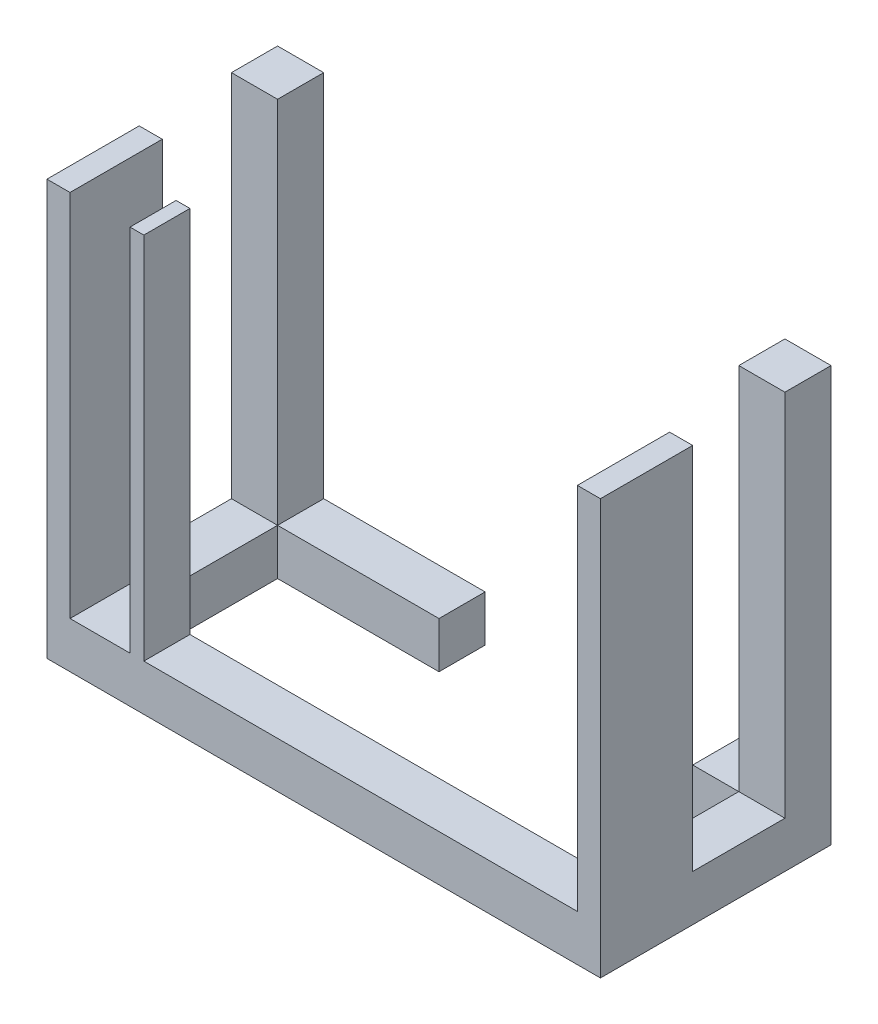
ISO-10303-21;
HEADER;
FILE_DESCRIPTION(('STEP AP214'),'2;1');
FILE_NAME('part.step','',(''),(''),'','','');
FILE_SCHEMA(('AUTOMOTIVE_DESIGN { 1 0 10303 214 1 1 1 1 }'));
ENDSEC;
DATA;
#1=APPLICATION_CONTEXT('core data for automotive mechanical design processes');
#2=APPLICATION_PROTOCOL_DEFINITION('international standard','automotive_design',2000,#1);
#3=PRODUCT_CONTEXT('',#1,'mechanical');
#4=PRODUCT('Part','Part','',(#3));
#5=PRODUCT_RELATED_PRODUCT_CATEGORY('part','',(#4));
#6=PRODUCT_DEFINITION_FORMATION('','',#4);
#7=PRODUCT_DEFINITION_CONTEXT('part definition',#1,'design');
#8=PRODUCT_DEFINITION('design','',#6,#7);
#9=PRODUCT_DEFINITION_SHAPE('','',#8);
#10=(LENGTH_UNIT() NAMED_UNIT(*) SI_UNIT(.MILLI.,.METRE.));
#11=(NAMED_UNIT(*) PLANE_ANGLE_UNIT() SI_UNIT($,.RADIAN.));
#12=(NAMED_UNIT(*) SI_UNIT($,.STERADIAN.) SOLID_ANGLE_UNIT());
#13=UNCERTAINTY_MEASURE_WITH_UNIT(LENGTH_MEASURE(1.E-05),#10,'distance_accuracy_value','');
#14=(GEOMETRIC_REPRESENTATION_CONTEXT(3) GLOBAL_UNCERTAINTY_ASSIGNED_CONTEXT((#13)) GLOBAL_UNIT_ASSIGNED_CONTEXT((#10,
#11,#12)) REPRESENTATION_CONTEXT('',''));
#15=CARTESIAN_POINT('',(0.,0.,0.));
#16=DIRECTION('',(0.,0.,1.));
#17=DIRECTION('',(1.,0.,0.));
#18=AXIS2_PLACEMENT_3D('',#15,#16,#17);
#19=CARTESIAN_POINT('',(0.,10.,0.));
#20=DIRECTION('',(0.,-1.,0.));
#21=DIRECTION('',(0.,0.,-1.));
#22=AXIS2_PLACEMENT_3D('',#19,#20,#21);
#23=PLANE('',#22);
#24=DIRECTION('',(-1.,0.,0.));
#25=VECTOR('',#24,1.);
#26=CARTESIAN_POINT('',(-60.,10.,-25.));
#27=LINE('',#26,#25);
#28=CARTESIAN_POINT('',(50.,10.,-25.));
#29=VERTEX_POINT('',#28);
#30=CARTESIAN_POINT('',(40.,10.,-25.));
#31=VERTEX_POINT('',#30);
#32=EDGE_CURVE('E256',#29,#31,#27,.T.);
#33=ORIENTED_EDGE('',*,*,#32,.T.);
#34=DIRECTION('',(0.,0.,1.));
#35=VECTOR('',#34,1.);
#36=CARTESIAN_POINT('',(40.,10.,0.));
#37=LINE('',#36,#35);
#38=CARTESIAN_POINT('',(40.,10.,-15.));
#39=VERTEX_POINT('',#38);
#40=EDGE_CURVE('E302',#31,#39,#37,.T.);
#41=ORIENTED_EDGE('',*,*,#40,.T.);
#42=DIRECTION('',(-1.,0.,0.));
#43=VECTOR('',#42,1.);
#44=CARTESIAN_POINT('',(-50.,10.,-15.));
#45=LINE('',#44,#43);
#46=CARTESIAN_POINT('',(50.,10.,-15.));
#47=VERTEX_POINT('',#46);
#48=EDGE_CURVE('E244',#47,#39,#45,.T.);
#49=ORIENTED_EDGE('',*,*,#48,.F.);
#50=DIRECTION('',(0.,0.,1.));
#51=VECTOR('',#50,1.);
#52=CARTESIAN_POINT('',(50.,10.,-25.));
#53=LINE('',#52,#51);
#54=EDGE_CURVE('E328',#29,#47,#53,.T.);
#55=ORIENTED_EDGE('',*,*,#54,.F.);
#56=EDGE_LOOP('',(#33,#41,#49,#55));
#57=FACE_BOUND('',#56,.T.);
#58=ADVANCED_FACE('F35',(#57),#23,.F.);
#59=CARTESIAN_POINT('',(-60.,10.,-25.));
#60=DIRECTION('',(0.,0.,1.));
#61=DIRECTION('',(1.,0.,0.));
#62=AXIS2_PLACEMENT_3D('',#59,#60,#61);
#63=PLANE('',#62);
#64=DIRECTION('',(-1.,0.,0.));
#65=VECTOR('',#64,1.);
#66=CARTESIAN_POINT('',(-60.,0.,-25.));
#67=LINE('',#66,#65);
#68=CARTESIAN_POINT('',(60.,0.,-25.));
#69=VERTEX_POINT('',#68);
#70=CARTESIAN_POINT('',(40.,0.,-25.));
#71=VERTEX_POINT('',#70);
#72=EDGE_CURVE('E268',#69,#71,#67,.T.);
#73=ORIENTED_EDGE('',*,*,#72,.T.);
#74=DIRECTION('',(0.,-1.,0.));
#75=VECTOR('',#74,1.);
#76=CARTESIAN_POINT('',(40.,90.,-25.));
#77=LINE('',#76,#75);
#78=EDGE_CURVE('E298',#31,#71,#77,.T.);
#79=ORIENTED_EDGE('',*,*,#78,.F.);
#80=ORIENTED_EDGE('',*,*,#32,.F.);
#81=DIRECTION('',(0.,-1.,0.));
#82=VECTOR('',#81,1.);
#83=CARTESIAN_POINT('',(50.,90.,-25.));
#84=LINE('',#83,#82);
#85=CARTESIAN_POINT('',(50.,90.,-25.));
#86=VERTEX_POINT('',#85);
#87=EDGE_CURVE('E347',#86,#29,#84,.T.);
#88=ORIENTED_EDGE('',*,*,#87,.F.);
#89=DIRECTION('',(-1.,0.,0.));
#90=VECTOR('',#89,1.);
#91=CARTESIAN_POINT('',(60.,90.,-25.));
#92=LINE('',#91,#90);
#93=CARTESIAN_POINT('',(60.,90.,-25.));
#94=VERTEX_POINT('',#93);
#95=EDGE_CURVE('E288',#94,#86,#92,.T.);
#96=ORIENTED_EDGE('',*,*,#95,.F.);
#97=DIRECTION('',(0.,-1.,0.));
#98=VECTOR('',#97,1.);
#99=CARTESIAN_POINT('',(60.,10.,-25.));
#100=LINE('',#99,#98);
#101=EDGE_CURVE('E217',#94,#69,#100,.T.);
#102=ORIENTED_EDGE('',*,*,#101,.T.);
#103=EDGE_LOOP('',(#73,#79,#80,#88,#96,#102));
#104=FACE_BOUND('',#103,.T.);
#105=ADVANCED_FACE('F285',(#104),#63,.F.);
#106=CARTESIAN_POINT('',(-50.,10.,-15.));
#107=DIRECTION('',(0.,0.,1.));
#108=DIRECTION('',(1.,0.,0.));
#109=AXIS2_PLACEMENT_3D('',#106,#107,#108);
#110=PLANE('',#109);
#111=DIRECTION('',(0.,1.,0.));
#112=VECTOR('',#111,1.);
#113=CARTESIAN_POINT('',(40.,10.,-15.));
#114=LINE('',#113,#112);
#115=CARTESIAN_POINT('',(40.,0.,-15.));
#116=VERTEX_POINT('',#115);
#117=EDGE_CURVE('E11',#116,#39,#114,.T.);
#118=ORIENTED_EDGE('',*,*,#117,.F.);
#119=DIRECTION('',(-1.,0.,0.));
#120=VECTOR('',#119,1.);
#121=CARTESIAN_POINT('',(-50.,0.,-15.));
#122=LINE('',#121,#120);
#123=CARTESIAN_POINT('',(50.,0.,-15.));
#124=VERTEX_POINT('',#123);
#125=EDGE_CURVE('E232',#124,#116,#122,.T.);
#126=ORIENTED_EDGE('',*,*,#125,.F.);
#127=DIRECTION('',(0.,-1.,0.));
#128=VECTOR('',#127,1.);
#129=CARTESIAN_POINT('',(50.,10.,-15.));
#130=LINE('',#129,#128);
#131=EDGE_CURVE('E243',#47,#124,#130,.T.);
#132=ORIENTED_EDGE('',*,*,#131,.F.);
#133=ORIENTED_EDGE('',*,*,#48,.T.);
#134=EDGE_LOOP('',(#118,#126,#132,#133));
#135=FACE_BOUND('',#134,.T.);
#136=ADVANCED_FACE('F521',(#135),#110,.T.);
#137=DIRECTION('',(0.,0.,-1.));
#138=VECTOR('',#137,1.);
#139=CARTESIAN_POINT('',(-39.,10.,25.));
#140=LINE('',#139,#138);
#141=CARTESIAN_POINT('',(-39.,10.,25.));
#142=VERTEX_POINT('',#141);
#143=CARTESIAN_POINT('',(-39.,10.,15.));
#144=VERTEX_POINT('',#143);
#145=EDGE_CURVE('E305',#142,#144,#140,.T.);
#146=ORIENTED_EDGE('',*,*,#145,.F.);
#147=DIRECTION('',(1.,0.,0.));
#148=VECTOR('',#147,1.);
#149=CARTESIAN_POINT('',(-60.,10.,25.));
#150=LINE('',#149,#148);
#151=CARTESIAN_POINT('',(55.,10.,25.));
#152=VERTEX_POINT('',#151);
#153=EDGE_CURVE('E261',#142,#152,#150,.T.);
#154=ORIENTED_EDGE('',*,*,#153,.T.);
#155=DIRECTION('',(0.,0.,1.));
#156=VECTOR('',#155,1.);
#157=CARTESIAN_POINT('',(55.,10.,25.));
#158=LINE('',#157,#156);
#159=CARTESIAN_POINT('',(55.,10.,4.99999999999999));
#160=VERTEX_POINT('',#159);
#161=EDGE_CURVE('E404',#160,#152,#158,.T.);
#162=ORIENTED_EDGE('',*,*,#161,.F.);
#163=DIRECTION('',(-1.,0.,0.));
#164=VECTOR('',#163,1.);
#165=CARTESIAN_POINT('',(60.,10.,4.99999999999999));
#166=LINE('',#165,#164);
#167=CARTESIAN_POINT('',(60.,10.,4.99999999999999));
#168=VERTEX_POINT('',#167);
#169=EDGE_CURVE('E399',#168,#160,#166,.T.);
#170=ORIENTED_EDGE('',*,*,#169,.F.);
#171=DIRECTION('',(0.,0.,-1.));
#172=VECTOR('',#171,1.);
#173=CARTESIAN_POINT('',(60.,10.,25.));
#174=LINE('',#173,#172);
#175=CARTESIAN_POINT('',(60.,10.,-15.));
#176=VERTEX_POINT('',#175);
#177=EDGE_CURVE('E252',#168,#176,#174,.T.);
#178=ORIENTED_EDGE('',*,*,#177,.T.);
#179=DIRECTION('',(1.,0.,0.));
#180=VECTOR('',#179,1.);
#181=CARTESIAN_POINT('',(60.,10.,-15.));
#182=LINE('',#181,#180);
#183=EDGE_CURVE('E331',#47,#176,#182,.T.);
#184=ORIENTED_EDGE('',*,*,#183,.F.);
#185=DIRECTION('',(0.,0.,-1.));
#186=VECTOR('',#185,1.);
#187=CARTESIAN_POINT('',(50.,10.,15.));
#188=LINE('',#187,#186);
#189=CARTESIAN_POINT('',(50.,10.,15.));
#190=VERTEX_POINT('',#189);
#191=EDGE_CURVE('E430',#190,#47,#188,.T.);
#192=ORIENTED_EDGE('',*,*,#191,.F.);
#193=DIRECTION('',(1.,0.,0.));
#194=VECTOR('',#193,1.);
#195=CARTESIAN_POINT('',(-50.,10.,15.));
#196=LINE('',#195,#194);
#197=EDGE_CURVE('E426',#144,#190,#196,.T.);
#198=ORIENTED_EDGE('',*,*,#197,.F.);
#199=EDGE_LOOP('',(#146,#154,#162,#170,#178,#184,#192,#198));
#200=FACE_BOUND('',#199,.T.);
#201=ADVANCED_FACE('F496',(#200),#23,.F.);
#202=DIRECTION('',(0.,0.,1.));
#203=VECTOR('',#202,1.);
#204=CARTESIAN_POINT('',(-42.,10.,25.));
#205=LINE('',#204,#203);
#206=CARTESIAN_POINT('',(-42.,10.,15.));
#207=VERTEX_POINT('',#206);
#208=CARTESIAN_POINT('',(-42.,10.,25.));
#209=VERTEX_POINT('',#208);
#210=EDGE_CURVE('E310',#207,#209,#205,.T.);
#211=ORIENTED_EDGE('',*,*,#210,.F.);
#212=CARTESIAN_POINT('',(-50.,10.,15.));
#213=VERTEX_POINT('',#212);
#214=EDGE_CURVE('E427',#213,#207,#196,.T.);
#215=ORIENTED_EDGE('',*,*,#214,.F.);
#216=DIRECTION('',(0.,0.,1.));
#217=VECTOR('',#216,1.);
#218=CARTESIAN_POINT('',(-50.,10.,15.));
#219=LINE('',#218,#217);
#220=CARTESIAN_POINT('',(-50.,10.,-15.));
#221=VERTEX_POINT('',#220);
#222=EDGE_CURVE('E236',#221,#213,#219,.T.);
#223=ORIENTED_EDGE('',*,*,#222,.F.);
#224=DIRECTION('',(1.,0.,0.));
#225=VECTOR('',#224,1.);
#226=CARTESIAN_POINT('',(-60.,10.,-15.));
#227=LINE('',#226,#225);
#228=CARTESIAN_POINT('',(-60.,10.,-15.));
#229=VERTEX_POINT('',#228);
#230=EDGE_CURVE('E350',#229,#221,#227,.T.);
#231=ORIENTED_EDGE('',*,*,#230,.F.);
#232=DIRECTION('',(0.,0.,1.));
#233=VECTOR('',#232,1.);
#234=CARTESIAN_POINT('',(-60.,10.,25.));
#235=LINE('',#234,#233);
#236=CARTESIAN_POINT('',(-60.,10.,4.99999999999999));
#237=VERTEX_POINT('',#236);
#238=EDGE_CURVE('E259',#229,#237,#235,.T.);
#239=ORIENTED_EDGE('',*,*,#238,.T.);
#240=DIRECTION('',(-1.,0.,0.));
#241=VECTOR('',#240,1.);
#242=CARTESIAN_POINT('',(-60.,10.,4.99999999999999));
#243=LINE('',#242,#241);
#244=CARTESIAN_POINT('',(-55.,10.,4.99999999999999));
#245=VERTEX_POINT('',#244);
#246=EDGE_CURVE('E380',#245,#237,#243,.T.);
#247=ORIENTED_EDGE('',*,*,#246,.F.);
#248=DIRECTION('',(0.,0.,-1.));
#249=VECTOR('',#248,1.);
#250=CARTESIAN_POINT('',(-55.,10.,25.));
#251=LINE('',#250,#249);
#252=CARTESIAN_POINT('',(-55.,10.,25.));
#253=VERTEX_POINT('',#252);
#254=EDGE_CURVE('E375',#253,#245,#251,.T.);
#255=ORIENTED_EDGE('',*,*,#254,.F.);
#256=EDGE_CURVE('E262',#253,#209,#150,.T.);
#257=ORIENTED_EDGE('',*,*,#256,.T.);
#258=EDGE_LOOP('',(#211,#215,#223,#231,#239,#247,#255,#257));
#259=FACE_BOUND('',#258,.T.);
#260=ADVANCED_FACE('F449',(#259),#23,.F.);
#261=CARTESIAN_POINT('',(-15.,10.,-15.));
#262=VERTEX_POINT('',#261);
#263=EDGE_CURVE('E433',#262,#221,#45,.T.);
#264=ORIENTED_EDGE('',*,*,#263,.F.);
#265=DIRECTION('',(0.,0.,-1.));
#266=VECTOR('',#265,1.);
#267=CARTESIAN_POINT('',(-15.,10.,0.));
#268=LINE('',#267,#266);
#269=CARTESIAN_POINT('',(-15.,10.,-25.));
#270=VERTEX_POINT('',#269);
#271=EDGE_CURVE('E50',#262,#270,#268,.T.);
#272=ORIENTED_EDGE('',*,*,#271,.T.);
#273=CARTESIAN_POINT('',(-50.,10.,-25.));
#274=VERTEX_POINT('',#273);
#275=EDGE_CURVE('E254',#270,#274,#27,.T.);
#276=ORIENTED_EDGE('',*,*,#275,.T.);
#277=DIRECTION('',(0.,0.,-1.));
#278=VECTOR('',#277,1.);
#279=CARTESIAN_POINT('',(-50.,10.,-25.));
#280=LINE('',#279,#278);
#281=EDGE_CURVE('E355',#221,#274,#280,.T.);
#282=ORIENTED_EDGE('',*,*,#281,.F.);
#283=EDGE_LOOP('',(#264,#272,#276,#282));
#284=FACE_BOUND('',#283,.T.);
#285=ADVANCED_FACE('F536',(#284),#23,.F.);
#286=CARTESIAN_POINT('',(0.,0.,0.));
#287=DIRECTION('',(0.,-1.,0.));
#288=DIRECTION('',(0.,0.,-1.));
#289=AXIS2_PLACEMENT_3D('',#286,#287,#288);
#290=PLANE('',#289);
#291=DIRECTION('',(0.,0.,1.));
#292=VECTOR('',#291,1.);
#293=CARTESIAN_POINT('',(40.,0.,-15.));
#294=LINE('',#293,#292);
#295=EDGE_CURVE('E57',#71,#116,#294,.T.);
#296=ORIENTED_EDGE('',*,*,#295,.F.);
#297=ORIENTED_EDGE('',*,*,#72,.F.);
#298=DIRECTION('',(0.,0.,-1.));
#299=VECTOR('',#298,1.);
#300=CARTESIAN_POINT('',(60.,0.,25.));
#301=LINE('',#300,#299);
#302=CARTESIAN_POINT('',(60.,0.,25.));
#303=VERTEX_POINT('',#302);
#304=EDGE_CURVE('E251',#303,#69,#301,.T.);
#305=ORIENTED_EDGE('',*,*,#304,.F.);
#306=DIRECTION('',(1.,0.,0.));
#307=VECTOR('',#306,1.);
#308=CARTESIAN_POINT('',(-60.,0.,25.));
#309=LINE('',#308,#307);
#310=CARTESIAN_POINT('',(-60.,0.,25.));
#311=VERTEX_POINT('',#310);
#312=EDGE_CURVE('E255',#311,#303,#309,.T.);
#313=ORIENTED_EDGE('',*,*,#312,.F.);
#314=DIRECTION('',(0.,0.,1.));
#315=VECTOR('',#314,1.);
#316=CARTESIAN_POINT('',(-60.,0.,25.));
#317=LINE('',#316,#315);
#318=CARTESIAN_POINT('',(-60.,0.,-25.));
#319=VERTEX_POINT('',#318);
#320=EDGE_CURVE('E271',#319,#311,#317,.T.);
#321=ORIENTED_EDGE('',*,*,#320,.F.);
#322=CARTESIAN_POINT('',(-15.,0.,-25.));
#323=VERTEX_POINT('',#322);
#324=EDGE_CURVE('E225',#323,#319,#67,.T.);
#325=ORIENTED_EDGE('',*,*,#324,.F.);
#326=DIRECTION('',(0.,0.,-1.));
#327=VECTOR('',#326,1.);
#328=CARTESIAN_POINT('',(-15.,0.,-15.));
#329=LINE('',#328,#327);
#330=CARTESIAN_POINT('',(-15.,0.,-15.));
#331=VERTEX_POINT('',#330);
#332=EDGE_CURVE('E212',#331,#323,#329,.T.);
#333=ORIENTED_EDGE('',*,*,#332,.F.);
#334=CARTESIAN_POINT('',(-50.,0.,-15.));
#335=VERTEX_POINT('',#334);
#336=EDGE_CURVE('E222',#331,#335,#122,.T.);
#337=ORIENTED_EDGE('',*,*,#336,.T.);
#338=DIRECTION('',(0.,0.,1.));
#339=VECTOR('',#338,1.);
#340=CARTESIAN_POINT('',(-50.,0.,15.));
#341=LINE('',#340,#339);
#342=CARTESIAN_POINT('',(-50.,0.,15.));
#343=VERTEX_POINT('',#342);
#344=EDGE_CURVE('E424',#335,#343,#341,.T.);
#345=ORIENTED_EDGE('',*,*,#344,.T.);
#346=DIRECTION('',(1.,0.,0.));
#347=VECTOR('',#346,1.);
#348=CARTESIAN_POINT('',(-50.,0.,15.));
#349=LINE('',#348,#347);
#350=CARTESIAN_POINT('',(50.,0.,15.));
#351=VERTEX_POINT('',#350);
#352=EDGE_CURVE('E238',#343,#351,#349,.T.);
#353=ORIENTED_EDGE('',*,*,#352,.T.);
#354=DIRECTION('',(0.,0.,-1.));
#355=VECTOR('',#354,1.);
#356=CARTESIAN_POINT('',(50.,0.,15.));
#357=LINE('',#356,#355);
#358=EDGE_CURVE('E233',#351,#124,#357,.T.);
#359=ORIENTED_EDGE('',*,*,#358,.T.);
#360=ORIENTED_EDGE('',*,*,#125,.T.);
#361=EDGE_LOOP('',(#296,#297,#305,#313,#321,#325,#333,#337,#345,#353,#359,#360));
#362=FACE_BOUND('',#361,.T.);
#363=ADVANCED_FACE('F220',(#362),#290,.T.);
#364=CARTESIAN_POINT('',(60.,10.,25.));
#365=DIRECTION('',(-1.,0.,0.));
#366=DIRECTION('',(0.,0.,1.));
#367=AXIS2_PLACEMENT_3D('',#364,#365,#366);
#368=PLANE('',#367);
#369=ORIENTED_EDGE('',*,*,#304,.T.);
#370=ORIENTED_EDGE('',*,*,#101,.F.);
#371=DIRECTION('',(0.,0.,-1.));
#372=VECTOR('',#371,1.);
#373=CARTESIAN_POINT('',(60.,90.,-25.));
#374=LINE('',#373,#372);
#375=CARTESIAN_POINT('',(60.,90.,-15.));
#376=VERTEX_POINT('',#375);
#377=EDGE_CURVE('E329',#376,#94,#374,.T.);
#378=ORIENTED_EDGE('',*,*,#377,.F.);
#379=DIRECTION('',(0.,-1.,0.));
#380=VECTOR('',#379,1.);
#381=CARTESIAN_POINT('',(60.,90.,-15.));
#382=LINE('',#381,#380);
#383=EDGE_CURVE('E337',#376,#176,#382,.T.);
#384=ORIENTED_EDGE('',*,*,#383,.T.);
#385=ORIENTED_EDGE('',*,*,#177,.F.);
#386=DIRECTION('',(0.,-1.,0.));
#387=VECTOR('',#386,1.);
#388=CARTESIAN_POINT('',(60.,90.,4.99999999999999));
#389=LINE('',#388,#387);
#390=CARTESIAN_POINT('',(60.,90.,4.99999999999999));
#391=VERTEX_POINT('',#390);
#392=EDGE_CURVE('E421',#391,#168,#389,.T.);
#393=ORIENTED_EDGE('',*,*,#392,.F.);
#394=DIRECTION('',(0.,0.,-1.));
#395=VECTOR('',#394,1.);
#396=CARTESIAN_POINT('',(60.,90.,25.));
#397=LINE('',#396,#395);
#398=CARTESIAN_POINT('',(60.,90.,25.));
#399=VERTEX_POINT('',#398);
#400=EDGE_CURVE('E400',#399,#391,#397,.T.);
#401=ORIENTED_EDGE('',*,*,#400,.F.);
#402=DIRECTION('',(0.,-1.,0.));
#403=VECTOR('',#402,1.);
#404=CARTESIAN_POINT('',(60.,10.,25.));
#405=LINE('',#404,#403);
#406=EDGE_CURVE('E265',#399,#303,#405,.T.);
#407=ORIENTED_EDGE('',*,*,#406,.T.);
#408=EDGE_LOOP('',(#369,#370,#378,#384,#385,#393,#401,#407));
#409=FACE_BOUND('',#408,.T.);
#410=ADVANCED_FACE('F37',(#409),#368,.F.);
#411=ORIENTED_EDGE('',*,*,#275,.F.);
#412=DIRECTION('',(0.,-1.,0.));
#413=VECTOR('',#412,1.);
#414=CARTESIAN_POINT('',(-15.,90.,-25.));
#415=LINE('',#414,#413);
#416=EDGE_CURVE('E226',#270,#323,#415,.T.);
#417=ORIENTED_EDGE('',*,*,#416,.T.);
#418=ORIENTED_EDGE('',*,*,#324,.T.);
#419=DIRECTION('',(0.,-1.,0.));
#420=VECTOR('',#419,1.);
#421=CARTESIAN_POINT('',(-60.,10.,-25.));
#422=LINE('',#421,#420);
#423=CARTESIAN_POINT('',(-60.,90.,-25.));
#424=VERTEX_POINT('',#423);
#425=EDGE_CURVE('E279',#424,#319,#422,.T.);
#426=ORIENTED_EDGE('',*,*,#425,.F.);
#427=DIRECTION('',(-1.,0.,0.));
#428=VECTOR('',#427,1.);
#429=CARTESIAN_POINT('',(-60.,90.,-25.));
#430=LINE('',#429,#428);
#431=CARTESIAN_POINT('',(-50.,90.,-25.));
#432=VERTEX_POINT('',#431);
#433=EDGE_CURVE('E359',#432,#424,#430,.T.);
#434=ORIENTED_EDGE('',*,*,#433,.F.);
#435=DIRECTION('',(0.,-1.,0.));
#436=VECTOR('',#435,1.);
#437=CARTESIAN_POINT('',(-50.,90.,-25.));
#438=LINE('',#437,#436);
#439=EDGE_CURVE('E362',#432,#274,#438,.T.);
#440=ORIENTED_EDGE('',*,*,#439,.T.);
#441=EDGE_LOOP('',(#411,#417,#418,#426,#434,#440));
#442=FACE_BOUND('',#441,.T.);
#443=ADVANCED_FACE('F542',(#442),#63,.F.);
#444=CARTESIAN_POINT('',(-60.,10.,25.));
#445=DIRECTION('',(1.,0.,0.));
#446=DIRECTION('',(0.,0.,-1.));
#447=AXIS2_PLACEMENT_3D('',#444,#445,#446);
#448=PLANE('',#447);
#449=ORIENTED_EDGE('',*,*,#320,.T.);
#450=DIRECTION('',(0.,-1.,0.));
#451=VECTOR('',#450,1.);
#452=CARTESIAN_POINT('',(-60.,10.,25.));
#453=LINE('',#452,#451);
#454=CARTESIAN_POINT('',(-60.,90.,25.));
#455=VERTEX_POINT('',#454);
#456=EDGE_CURVE('E276',#455,#311,#453,.T.);
#457=ORIENTED_EDGE('',*,*,#456,.F.);
#458=DIRECTION('',(0.,0.,1.));
#459=VECTOR('',#458,1.);
#460=CARTESIAN_POINT('',(-60.,90.,25.));
#461=LINE('',#460,#459);
#462=CARTESIAN_POINT('',(-60.,90.,4.99999999999999));
#463=VERTEX_POINT('',#462);
#464=EDGE_CURVE('E376',#463,#455,#461,.T.);
#465=ORIENTED_EDGE('',*,*,#464,.F.);
#466=DIRECTION('',(0.,-1.,0.));
#467=VECTOR('',#466,1.);
#468=CARTESIAN_POINT('',(-60.,90.,4.99999999999999));
#469=LINE('',#468,#467);
#470=EDGE_CURVE('E386',#463,#237,#469,.T.);
#471=ORIENTED_EDGE('',*,*,#470,.T.);
#472=ORIENTED_EDGE('',*,*,#238,.F.);
#473=DIRECTION('',(0.,-1.,0.));
#474=VECTOR('',#473,1.);
#475=CARTESIAN_POINT('',(-60.,90.,-15.));
#476=LINE('',#475,#474);
#477=CARTESIAN_POINT('',(-60.,90.,-15.));
#478=VERTEX_POINT('',#477);
#479=EDGE_CURVE('E372',#478,#229,#476,.T.);
#480=ORIENTED_EDGE('',*,*,#479,.F.);
#481=DIRECTION('',(0.,0.,1.));
#482=VECTOR('',#481,1.);
#483=CARTESIAN_POINT('',(-60.,90.,-25.));
#484=LINE('',#483,#482);
#485=EDGE_CURVE('E351',#424,#478,#484,.T.);
#486=ORIENTED_EDGE('',*,*,#485,.F.);
#487=ORIENTED_EDGE('',*,*,#425,.T.);
#488=EDGE_LOOP('',(#449,#457,#465,#471,#472,#480,#486,#487));
#489=FACE_BOUND('',#488,.T.);
#490=ADVANCED_FACE('F464',(#489),#448,.F.);
#491=CARTESIAN_POINT('',(-60.,10.,25.));
#492=DIRECTION('',(0.,0.,-1.));
#493=DIRECTION('',(-1.,0.,0.));
#494=AXIS2_PLACEMENT_3D('',#491,#492,#493);
#495=PLANE('',#494);
#496=ORIENTED_EDGE('',*,*,#312,.T.);
#497=ORIENTED_EDGE('',*,*,#406,.F.);
#498=DIRECTION('',(1.,0.,0.));
#499=VECTOR('',#498,1.);
#500=CARTESIAN_POINT('',(60.,90.,25.));
#501=LINE('',#500,#499);
#502=CARTESIAN_POINT('',(55.,90.,25.));
#503=VERTEX_POINT('',#502);
#504=EDGE_CURVE('E408',#503,#399,#501,.T.);
#505=ORIENTED_EDGE('',*,*,#504,.F.);
#506=DIRECTION('',(0.,-1.,0.));
#507=VECTOR('',#506,1.);
#508=CARTESIAN_POINT('',(55.,90.,25.));
#509=LINE('',#508,#507);
#510=EDGE_CURVE('E411',#503,#152,#509,.T.);
#511=ORIENTED_EDGE('',*,*,#510,.T.);
#512=ORIENTED_EDGE('',*,*,#153,.F.);
#513=DIRECTION('',(0.,-1.,0.));
#514=VECTOR('',#513,1.);
#515=CARTESIAN_POINT('',(-39.,90.,25.));
#516=LINE('',#515,#514);
#517=CARTESIAN_POINT('',(-39.,90.,25.));
#518=VERTEX_POINT('',#517);
#519=EDGE_CURVE('E316',#518,#142,#516,.T.);
#520=ORIENTED_EDGE('',*,*,#519,.F.);
#521=DIRECTION('',(1.,0.,0.));
#522=VECTOR('',#521,1.);
#523=CARTESIAN_POINT('',(-39.,90.,25.));
#524=LINE('',#523,#522);
#525=CARTESIAN_POINT('',(-42.,90.,25.));
#526=VERTEX_POINT('',#525);
#527=EDGE_CURVE('E314',#526,#518,#524,.T.);
#528=ORIENTED_EDGE('',*,*,#527,.F.);
#529=DIRECTION('',(0.,-1.,0.));
#530=VECTOR('',#529,1.);
#531=CARTESIAN_POINT('',(-42.,90.,25.));
#532=LINE('',#531,#530);
#533=EDGE_CURVE('E320',#526,#209,#532,.T.);
#534=ORIENTED_EDGE('',*,*,#533,.T.);
#535=ORIENTED_EDGE('',*,*,#256,.F.);
#536=DIRECTION('',(0.,-1.,0.));
#537=VECTOR('',#536,1.);
#538=CARTESIAN_POINT('',(-55.,90.,25.));
#539=LINE('',#538,#537);
#540=CARTESIAN_POINT('',(-55.,90.,25.));
#541=VERTEX_POINT('',#540);
#542=EDGE_CURVE('E396',#541,#253,#539,.T.);
#543=ORIENTED_EDGE('',*,*,#542,.F.);
#544=DIRECTION('',(1.,0.,0.));
#545=VECTOR('',#544,1.);
#546=CARTESIAN_POINT('',(-60.,90.,25.));
#547=LINE('',#546,#545);
#548=EDGE_CURVE('E379',#455,#541,#547,.T.);
#549=ORIENTED_EDGE('',*,*,#548,.F.);
#550=ORIENTED_EDGE('',*,*,#456,.T.);
#551=EDGE_LOOP('',(#496,#497,#505,#511,#512,#520,#528,#534,#535,#543,#549,#550));
#552=FACE_BOUND('',#551,.T.);
#553=ADVANCED_FACE('F477',(#552),#495,.F.);
#554=CARTESIAN_POINT('',(-50.,10.,15.));
#555=DIRECTION('',(1.,0.,0.));
#556=DIRECTION('',(0.,0.,-1.));
#557=AXIS2_PLACEMENT_3D('',#554,#555,#556);
#558=PLANE('',#557);
#559=ORIENTED_EDGE('',*,*,#344,.F.);
#560=DIRECTION('',(0.,-1.,0.));
#561=VECTOR('',#560,1.);
#562=CARTESIAN_POINT('',(-50.,10.,-15.));
#563=LINE('',#562,#561);
#564=EDGE_CURVE('E231',#221,#335,#563,.T.);
#565=ORIENTED_EDGE('',*,*,#564,.F.);
#566=ORIENTED_EDGE('',*,*,#222,.T.);
#567=DIRECTION('',(0.,-1.,0.));
#568=VECTOR('',#567,1.);
#569=CARTESIAN_POINT('',(-50.,10.,15.));
#570=LINE('',#569,#568);
#571=EDGE_CURVE('E248',#213,#343,#570,.T.);
#572=ORIENTED_EDGE('',*,*,#571,.T.);
#573=EDGE_LOOP('',(#559,#565,#566,#572));
#574=FACE_BOUND('',#573,.T.);
#575=ADVANCED_FACE('F444',(#574),#558,.T.);
#576=CARTESIAN_POINT('',(-50.,10.,15.));
#577=DIRECTION('',(0.,0.,-1.));
#578=DIRECTION('',(-1.,0.,0.));
#579=AXIS2_PLACEMENT_3D('',#576,#577,#578);
#580=PLANE('',#579);
#581=ORIENTED_EDGE('',*,*,#352,.F.);
#582=ORIENTED_EDGE('',*,*,#571,.F.);
#583=ORIENTED_EDGE('',*,*,#214,.T.);
#584=DIRECTION('',(0.,-1.,0.));
#585=VECTOR('',#584,1.);
#586=CARTESIAN_POINT('',(-42.,90.,15.));
#587=LINE('',#586,#585);
#588=CARTESIAN_POINT('',(-42.,90.,15.));
#589=VERTEX_POINT('',#588);
#590=EDGE_CURVE('E323',#589,#207,#587,.T.);
#591=ORIENTED_EDGE('',*,*,#590,.F.);
#592=DIRECTION('',(-1.,0.,0.));
#593=VECTOR('',#592,1.);
#594=CARTESIAN_POINT('',(-39.,90.,15.));
#595=LINE('',#594,#593);
#596=CARTESIAN_POINT('',(-39.,90.,15.));
#597=VERTEX_POINT('',#596);
#598=EDGE_CURVE('E309',#597,#589,#595,.T.);
#599=ORIENTED_EDGE('',*,*,#598,.F.);
#600=DIRECTION('',(0.,-1.,0.));
#601=VECTOR('',#600,1.);
#602=CARTESIAN_POINT('',(-39.,90.,15.));
#603=LINE('',#602,#601);
#604=EDGE_CURVE('E325',#597,#144,#603,.T.);
#605=ORIENTED_EDGE('',*,*,#604,.T.);
#606=ORIENTED_EDGE('',*,*,#197,.T.);
#607=DIRECTION('',(0.,-1.,0.));
#608=VECTOR('',#607,1.);
#609=CARTESIAN_POINT('',(50.,10.,15.));
#610=LINE('',#609,#608);
#611=EDGE_CURVE('E246',#190,#351,#610,.T.);
#612=ORIENTED_EDGE('',*,*,#611,.T.);
#613=EDGE_LOOP('',(#581,#582,#583,#591,#599,#605,#606,#612));
#614=FACE_BOUND('',#613,.T.);
#615=ADVANCED_FACE('F440',(#614),#580,.T.);
#616=CARTESIAN_POINT('',(50.,10.,15.));
#617=DIRECTION('',(-1.,0.,0.));
#618=DIRECTION('',(0.,0.,1.));
#619=AXIS2_PLACEMENT_3D('',#616,#617,#618);
#620=PLANE('',#619);
#621=ORIENTED_EDGE('',*,*,#358,.F.);
#622=ORIENTED_EDGE('',*,*,#611,.F.);
#623=ORIENTED_EDGE('',*,*,#191,.T.);
#624=ORIENTED_EDGE('',*,*,#131,.T.);
#625=EDGE_LOOP('',(#621,#622,#623,#624));
#626=FACE_BOUND('',#625,.T.);
#627=ADVANCED_FACE('F523',(#626),#620,.T.);
#628=DIRECTION('',(0.,-1.,0.));
#629=VECTOR('',#628,1.);
#630=CARTESIAN_POINT('',(-15.,10.,-15.));
#631=LINE('',#630,#629);
#632=EDGE_CURVE('E43',#262,#331,#631,.T.);
#633=ORIENTED_EDGE('',*,*,#632,.F.);
#634=ORIENTED_EDGE('',*,*,#263,.T.);
#635=ORIENTED_EDGE('',*,*,#564,.T.);
#636=ORIENTED_EDGE('',*,*,#336,.F.);
#637=EDGE_LOOP('',(#633,#634,#635,#636));
#638=FACE_BOUND('',#637,.T.);
#639=ADVANCED_FACE('F229',(#638),#110,.T.);
#640=CARTESIAN_POINT('',(60.,90.,4.99999999999999));
#641=DIRECTION('',(0.,0.,1.));
#642=DIRECTION('',(1.,0.,0.));
#643=AXIS2_PLACEMENT_3D('',#640,#641,#642);
#644=PLANE('',#643);
#645=ORIENTED_EDGE('',*,*,#169,.T.);
#646=DIRECTION('',(0.,-1.,0.));
#647=VECTOR('',#646,1.);
#648=CARTESIAN_POINT('',(55.,90.,4.99999999999999));
#649=LINE('',#648,#647);
#650=CARTESIAN_POINT('',(55.,90.,4.99999999999999));
#651=VERTEX_POINT('',#650);
#652=EDGE_CURVE('E418',#651,#160,#649,.T.);
#653=ORIENTED_EDGE('',*,*,#652,.F.);
#654=DIRECTION('',(-1.,0.,0.));
#655=VECTOR('',#654,1.);
#656=CARTESIAN_POINT('',(60.,90.,4.99999999999999));
#657=LINE('',#656,#655);
#658=EDGE_CURVE('E403',#391,#651,#657,.T.);
#659=ORIENTED_EDGE('',*,*,#658,.F.);
#660=ORIENTED_EDGE('',*,*,#392,.T.);
#661=EDGE_LOOP('',(#645,#653,#659,#660));
#662=FACE_BOUND('',#661,.T.);
#663=ADVANCED_FACE('F506',(#662),#644,.F.);
#664=CARTESIAN_POINT('',(55.,90.,25.));
#665=DIRECTION('',(1.,0.,0.));
#666=DIRECTION('',(0.,0.,-1.));
#667=AXIS2_PLACEMENT_3D('',#664,#665,#666);
#668=PLANE('',#667);
#669=ORIENTED_EDGE('',*,*,#161,.T.);
#670=ORIENTED_EDGE('',*,*,#510,.F.);
#671=DIRECTION('',(0.,0.,1.));
#672=VECTOR('',#671,1.);
#673=CARTESIAN_POINT('',(55.,90.,25.));
#674=LINE('',#673,#672);
#675=EDGE_CURVE('E406',#651,#503,#674,.T.);
#676=ORIENTED_EDGE('',*,*,#675,.F.);
#677=ORIENTED_EDGE('',*,*,#652,.T.);
#678=EDGE_LOOP('',(#669,#670,#676,#677));
#679=FACE_BOUND('',#678,.T.);
#680=ADVANCED_FACE('F502',(#679),#668,.F.);
#681=CARTESIAN_POINT('',(0.,90.,0.));
#682=DIRECTION('',(0.,1.,0.));
#683=DIRECTION('',(0.,0.,1.));
#684=AXIS2_PLACEMENT_3D('',#681,#682,#683);
#685=PLANE('',#684);
#686=ORIENTED_EDGE('',*,*,#400,.T.);
#687=ORIENTED_EDGE('',*,*,#658,.T.);
#688=ORIENTED_EDGE('',*,*,#675,.T.);
#689=ORIENTED_EDGE('',*,*,#504,.T.);
#690=EDGE_LOOP('',(#686,#687,#688,#689));
#691=FACE_BOUND('',#690,.T.);
#692=ADVANCED_FACE('F569',(#691),#685,.T.);
#693=CARTESIAN_POINT('',(-55.,90.,25.));
#694=DIRECTION('',(-1.,0.,0.));
#695=DIRECTION('',(0.,0.,1.));
#696=AXIS2_PLACEMENT_3D('',#693,#694,#695);
#697=PLANE('',#696);
#698=ORIENTED_EDGE('',*,*,#254,.T.);
#699=DIRECTION('',(0.,-1.,0.));
#700=VECTOR('',#699,1.);
#701=CARTESIAN_POINT('',(-55.,90.,4.99999999999999));
#702=LINE('',#701,#700);
#703=CARTESIAN_POINT('',(-55.,90.,4.99999999999999));
#704=VERTEX_POINT('',#703);
#705=EDGE_CURVE('E393',#704,#245,#702,.T.);
#706=ORIENTED_EDGE('',*,*,#705,.F.);
#707=DIRECTION('',(0.,0.,-1.));
#708=VECTOR('',#707,1.);
#709=CARTESIAN_POINT('',(-55.,90.,25.));
#710=LINE('',#709,#708);
#711=EDGE_CURVE('E382',#541,#704,#710,.T.);
#712=ORIENTED_EDGE('',*,*,#711,.F.);
#713=ORIENTED_EDGE('',*,*,#542,.T.);
#714=EDGE_LOOP('',(#698,#706,#712,#713));
#715=FACE_BOUND('',#714,.T.);
#716=ADVANCED_FACE('F474',(#715),#697,.F.);
#717=CARTESIAN_POINT('',(-60.,90.,4.99999999999999));
#718=DIRECTION('',(0.,0.,1.));
#719=DIRECTION('',(1.,0.,0.));
#720=AXIS2_PLACEMENT_3D('',#717,#718,#719);
#721=PLANE('',#720);
#722=ORIENTED_EDGE('',*,*,#246,.T.);
#723=ORIENTED_EDGE('',*,*,#470,.F.);
#724=DIRECTION('',(-1.,0.,0.));
#725=VECTOR('',#724,1.);
#726=CARTESIAN_POINT('',(-60.,90.,4.99999999999999));
#727=LINE('',#726,#725);
#728=EDGE_CURVE('E384',#704,#463,#727,.T.);
#729=ORIENTED_EDGE('',*,*,#728,.F.);
#730=ORIENTED_EDGE('',*,*,#705,.T.);
#731=EDGE_LOOP('',(#722,#723,#729,#730));
#732=FACE_BOUND('',#731,.T.);
#733=ADVANCED_FACE('F469',(#732),#721,.F.);
#734=CARTESIAN_POINT('',(0.,90.,0.));
#735=DIRECTION('',(0.,-1.,0.));
#736=DIRECTION('',(0.,0.,-1.));
#737=AXIS2_PLACEMENT_3D('',#734,#735,#736);
#738=PLANE('',#737);
#739=ORIENTED_EDGE('',*,*,#464,.T.);
#740=ORIENTED_EDGE('',*,*,#548,.T.);
#741=ORIENTED_EDGE('',*,*,#711,.T.);
#742=ORIENTED_EDGE('',*,*,#728,.T.);
#743=EDGE_LOOP('',(#739,#740,#741,#742));
#744=FACE_BOUND('',#743,.T.);
#745=ADVANCED_FACE('F556',(#744),#738,.F.);
#746=CARTESIAN_POINT('',(-60.,90.,-15.));
#747=DIRECTION('',(0.,0.,-1.));
#748=DIRECTION('',(-1.,0.,0.));
#749=AXIS2_PLACEMENT_3D('',#746,#747,#748);
#750=PLANE('',#749);
#751=ORIENTED_EDGE('',*,*,#230,.T.);
#752=DIRECTION('',(0.,-1.,0.));
#753=VECTOR('',#752,1.);
#754=CARTESIAN_POINT('',(-50.,90.,-15.));
#755=LINE('',#754,#753);
#756=CARTESIAN_POINT('',(-50.,90.,-15.));
#757=VERTEX_POINT('',#756);
#758=EDGE_CURVE('E369',#757,#221,#755,.T.);
#759=ORIENTED_EDGE('',*,*,#758,.F.);
#760=DIRECTION('',(1.,0.,0.));
#761=VECTOR('',#760,1.);
#762=CARTESIAN_POINT('',(-60.,90.,-15.));
#763=LINE('',#762,#761);
#764=EDGE_CURVE('E354',#478,#757,#763,.T.);
#765=ORIENTED_EDGE('',*,*,#764,.F.);
#766=ORIENTED_EDGE('',*,*,#479,.T.);
#767=EDGE_LOOP('',(#751,#759,#765,#766));
#768=FACE_BOUND('',#767,.T.);
#769=ADVANCED_FACE('F452',(#768),#750,.F.);
#770=CARTESIAN_POINT('',(-50.,90.,-25.));
#771=DIRECTION('',(-1.,0.,0.));
#772=DIRECTION('',(0.,0.,1.));
#773=AXIS2_PLACEMENT_3D('',#770,#771,#772);
#774=PLANE('',#773);
#775=ORIENTED_EDGE('',*,*,#281,.T.);
#776=ORIENTED_EDGE('',*,*,#439,.F.);
#777=DIRECTION('',(0.,0.,-1.));
#778=VECTOR('',#777,1.);
#779=CARTESIAN_POINT('',(-50.,90.,-25.));
#780=LINE('',#779,#778);
#781=EDGE_CURVE('E357',#757,#432,#780,.T.);
#782=ORIENTED_EDGE('',*,*,#781,.F.);
#783=ORIENTED_EDGE('',*,*,#758,.T.);
#784=EDGE_LOOP('',(#775,#776,#782,#783));
#785=FACE_BOUND('',#784,.T.);
#786=ADVANCED_FACE('F456',(#785),#774,.F.);
#787=CARTESIAN_POINT('',(0.,90.,0.));
#788=DIRECTION('',(0.,1.,0.));
#789=DIRECTION('',(0.,0.,1.));
#790=AXIS2_PLACEMENT_3D('',#787,#788,#789);
#791=PLANE('',#790);
#792=ORIENTED_EDGE('',*,*,#485,.T.);
#793=ORIENTED_EDGE('',*,*,#764,.T.);
#794=ORIENTED_EDGE('',*,*,#781,.T.);
#795=ORIENTED_EDGE('',*,*,#433,.T.);
#796=EDGE_LOOP('',(#792,#793,#794,#795));
#797=FACE_BOUND('',#796,.T.);
#798=ADVANCED_FACE('F461',(#797),#791,.T.);
#799=CARTESIAN_POINT('',(50.,90.,-25.));
#800=DIRECTION('',(1.,0.,0.));
#801=DIRECTION('',(0.,0.,-1.));
#802=AXIS2_PLACEMENT_3D('',#799,#800,#801);
#803=PLANE('',#802);
#804=ORIENTED_EDGE('',*,*,#54,.T.);
#805=DIRECTION('',(0.,-1.,0.));
#806=VECTOR('',#805,1.);
#807=CARTESIAN_POINT('',(50.,90.,-15.));
#808=LINE('',#807,#806);
#809=CARTESIAN_POINT('',(50.,90.,-15.));
#810=VERTEX_POINT('',#809);
#811=EDGE_CURVE('E344',#810,#47,#808,.T.);
#812=ORIENTED_EDGE('',*,*,#811,.F.);
#813=DIRECTION('',(0.,0.,1.));
#814=VECTOR('',#813,1.);
#815=CARTESIAN_POINT('',(50.,90.,-25.));
#816=LINE('',#815,#814);
#817=EDGE_CURVE('E333',#86,#810,#816,.T.);
#818=ORIENTED_EDGE('',*,*,#817,.F.);
#819=ORIENTED_EDGE('',*,*,#87,.T.);
#820=EDGE_LOOP('',(#804,#812,#818,#819));
#821=FACE_BOUND('',#820,.T.);
#822=ADVANCED_FACE('F516',(#821),#803,.F.);
#823=CARTESIAN_POINT('',(60.,90.,-15.));
#824=DIRECTION('',(0.,0.,-1.));
#825=DIRECTION('',(-1.,0.,0.));
#826=AXIS2_PLACEMENT_3D('',#823,#824,#825);
#827=PLANE('',#826);
#828=ORIENTED_EDGE('',*,*,#183,.T.);
#829=ORIENTED_EDGE('',*,*,#383,.F.);
#830=DIRECTION('',(1.,0.,0.));
#831=VECTOR('',#830,1.);
#832=CARTESIAN_POINT('',(60.,90.,-15.));
#833=LINE('',#832,#831);
#834=EDGE_CURVE('E335',#810,#376,#833,.T.);
#835=ORIENTED_EDGE('',*,*,#834,.F.);
#836=ORIENTED_EDGE('',*,*,#811,.T.);
#837=EDGE_LOOP('',(#828,#829,#835,#836));
#838=FACE_BOUND('',#837,.T.);
#839=ADVANCED_FACE('F511',(#838),#827,.F.);
#840=CARTESIAN_POINT('',(0.,90.,0.));
#841=DIRECTION('',(0.,-1.,0.));
#842=DIRECTION('',(0.,0.,-1.));
#843=AXIS2_PLACEMENT_3D('',#840,#841,#842);
#844=PLANE('',#843);
#845=ORIENTED_EDGE('',*,*,#377,.T.);
#846=ORIENTED_EDGE('',*,*,#95,.T.);
#847=ORIENTED_EDGE('',*,*,#817,.T.);
#848=ORIENTED_EDGE('',*,*,#834,.T.);
#849=EDGE_LOOP('',(#845,#846,#847,#848));
#850=FACE_BOUND('',#849,.T.);
#851=ADVANCED_FACE('F637',(#850),#844,.F.);
#852=CARTESIAN_POINT('',(-39.,90.,25.));
#853=DIRECTION('',(-1.,0.,0.));
#854=DIRECTION('',(0.,0.,1.));
#855=AXIS2_PLACEMENT_3D('',#852,#853,#854);
#856=PLANE('',#855);
#857=ORIENTED_EDGE('',*,*,#145,.T.);
#858=ORIENTED_EDGE('',*,*,#604,.F.);
#859=DIRECTION('',(0.,0.,-1.));
#860=VECTOR('',#859,1.);
#861=CARTESIAN_POINT('',(-39.,90.,25.));
#862=LINE('',#861,#860);
#863=EDGE_CURVE('E306',#518,#597,#862,.T.);
#864=ORIENTED_EDGE('',*,*,#863,.F.);
#865=ORIENTED_EDGE('',*,*,#519,.T.);
#866=EDGE_LOOP('',(#857,#858,#864,#865));
#867=FACE_BOUND('',#866,.T.);
#868=ADVANCED_FACE('F492',(#867),#856,.F.);
#869=CARTESIAN_POINT('',(-42.,90.,25.));
#870=DIRECTION('',(1.,0.,0.));
#871=DIRECTION('',(0.,0.,-1.));
#872=AXIS2_PLACEMENT_3D('',#869,#870,#871);
#873=PLANE('',#872);
#874=ORIENTED_EDGE('',*,*,#210,.T.);
#875=ORIENTED_EDGE('',*,*,#533,.F.);
#876=DIRECTION('',(0.,0.,1.));
#877=VECTOR('',#876,1.);
#878=CARTESIAN_POINT('',(-42.,90.,25.));
#879=LINE('',#878,#877);
#880=EDGE_CURVE('E312',#589,#526,#879,.T.);
#881=ORIENTED_EDGE('',*,*,#880,.F.);
#882=ORIENTED_EDGE('',*,*,#590,.T.);
#883=EDGE_LOOP('',(#874,#875,#881,#882));
#884=FACE_BOUND('',#883,.T.);
#885=ADVANCED_FACE('F484',(#884),#873,.F.);
#886=CARTESIAN_POINT('',(0.,90.,0.));
#887=DIRECTION('',(0.,1.,0.));
#888=DIRECTION('',(0.,0.,1.));
#889=AXIS2_PLACEMENT_3D('',#886,#887,#888);
#890=PLANE('',#889);
#891=ORIENTED_EDGE('',*,*,#863,.T.);
#892=ORIENTED_EDGE('',*,*,#598,.T.);
#893=ORIENTED_EDGE('',*,*,#880,.T.);
#894=ORIENTED_EDGE('',*,*,#527,.T.);
#895=EDGE_LOOP('',(#891,#892,#893,#894));
#896=FACE_BOUND('',#895,.T.);
#897=ADVANCED_FACE('F490',(#896),#890,.T.);
#898=CARTESIAN_POINT('',(-15.,90.,-15.));
#899=DIRECTION('',(-1.,0.,0.));
#900=DIRECTION('',(0.,0.,1.));
#901=AXIS2_PLACEMENT_3D('',#898,#899,#900);
#902=PLANE('',#901);
#903=ORIENTED_EDGE('',*,*,#632,.T.);
#904=ORIENTED_EDGE('',*,*,#332,.T.);
#905=ORIENTED_EDGE('',*,*,#416,.F.);
#906=ORIENTED_EDGE('',*,*,#271,.F.);
#907=EDGE_LOOP('',(#903,#904,#905,#906));
#908=FACE_BOUND('',#907,.T.);
#909=ADVANCED_FACE('F211',(#908),#902,.F.);
#910=CARTESIAN_POINT('',(40.,90.,-15.));
#911=DIRECTION('',(1.,0.,0.));
#912=DIRECTION('',(0.,0.,-1.));
#913=AXIS2_PLACEMENT_3D('',#910,#911,#912);
#914=PLANE('',#913);
#915=ORIENTED_EDGE('',*,*,#78,.T.);
#916=ORIENTED_EDGE('',*,*,#295,.T.);
#917=ORIENTED_EDGE('',*,*,#117,.T.);
#918=ORIENTED_EDGE('',*,*,#40,.F.);
#919=EDGE_LOOP('',(#915,#916,#917,#918));
#920=FACE_BOUND('',#919,.T.);
#921=ADVANCED_FACE('F678',(#920),#914,.F.);
#922=CLOSED_SHELL('',(#58,#105,#136,#201,#260,#285,#363,#410,#443,#490,#553,#575,#615,#627,#639,
#663,#680,#692,#716,#733,#745,#769,#786,#798,#822,#839,#851,#868,#885,#897,#909,#921));
#923=MANIFOLD_SOLID_BREP('B2',#922);
#924=ADVANCED_BREP_SHAPE_REPRESENTATION('',(#18,#923),#14);
#925=SHAPE_DEFINITION_REPRESENTATION(#9,#924);
ENDSEC;
END-ISO-10303-21;
